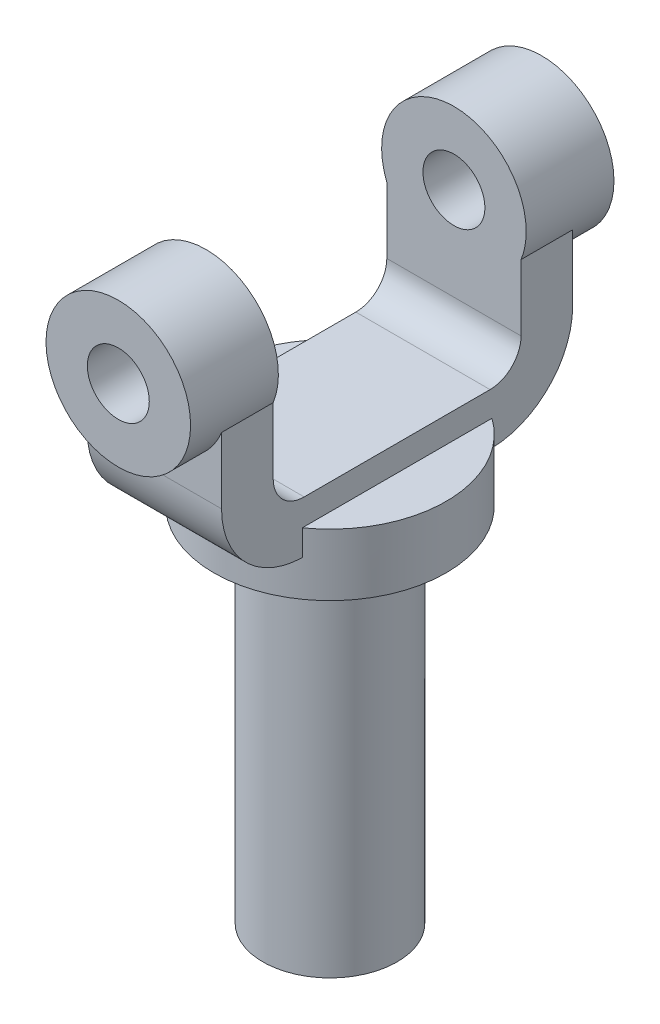
ISO-10303-21;
HEADER;
FILE_DESCRIPTION(('STEP AP214'),'2;1');
FILE_NAME('part.step','',(''),(''),'','','');
FILE_SCHEMA(('AUTOMOTIVE_DESIGN { 1 0 10303 214 1 1 1 1 }'));
ENDSEC;
DATA;
#1=APPLICATION_CONTEXT('core data for automotive mechanical design processes');
#2=APPLICATION_PROTOCOL_DEFINITION('international standard','automotive_design',2000,#1);
#3=PRODUCT_CONTEXT('',#1,'mechanical');
#4=PRODUCT('Part','Part','',(#3));
#5=PRODUCT_RELATED_PRODUCT_CATEGORY('part','',(#4));
#6=PRODUCT_DEFINITION_FORMATION('','',#4);
#7=PRODUCT_DEFINITION_CONTEXT('part definition',#1,'design');
#8=PRODUCT_DEFINITION('design','',#6,#7);
#9=PRODUCT_DEFINITION_SHAPE('','',#8);
#10=(LENGTH_UNIT() NAMED_UNIT(*) SI_UNIT(.MILLI.,.METRE.));
#11=(NAMED_UNIT(*) PLANE_ANGLE_UNIT() SI_UNIT($,.RADIAN.));
#12=(NAMED_UNIT(*) SI_UNIT($,.STERADIAN.) SOLID_ANGLE_UNIT());
#13=UNCERTAINTY_MEASURE_WITH_UNIT(LENGTH_MEASURE(1.E-05),#10,'distance_accuracy_value','');
#14=(GEOMETRIC_REPRESENTATION_CONTEXT(3) GLOBAL_UNCERTAINTY_ASSIGNED_CONTEXT((#13)) GLOBAL_UNIT_ASSIGNED_CONTEXT((#10,
#11,#12)) REPRESENTATION_CONTEXT('',''));
#15=CARTESIAN_POINT('',(0.,0.,0.));
#16=DIRECTION('',(0.,0.,1.));
#17=DIRECTION('',(1.,0.,0.));
#18=AXIS2_PLACEMENT_3D('',#15,#16,#17);
#19=CARTESIAN_POINT('',(13.,11.,18.));
#20=DIRECTION('',(-1.,0.,0.));
#21=DIRECTION('',(0.,0.,1.));
#22=AXIS2_PLACEMENT_3D('',#19,#20,#21);
#23=PLANE('',#22);
#24=DIRECTION('',(0.,0.,-1.));
#25=VECTOR('',#24,1.);
#26=CARTESIAN_POINT('',(13.,23.8079969841098,41.));
#27=LINE('',#26,#25);
#28=CARTESIAN_POINT('',(13.,23.8079969841098,34.));
#29=VERTEX_POINT('',#28);
#30=CARTESIAN_POINT('',(13.,23.8079969841098,24.));
#31=VERTEX_POINT('',#30);
#32=EDGE_CURVE('E145',#29,#31,#27,.T.);
#33=ORIENTED_EDGE('',*,*,#32,.F.);
#34=DIRECTION('',(0.,-1.,0.));
#35=VECTOR('',#34,1.);
#36=CARTESIAN_POINT('',(13.,29.,34.));
#37=LINE('',#36,#35);
#38=CARTESIAN_POINT('',(13.,11.,34.));
#39=VERTEX_POINT('',#38);
#40=EDGE_CURVE('E167',#29,#39,#37,.T.);
#41=ORIENTED_EDGE('',*,*,#40,.T.);
#42=CARTESIAN_POINT('',(13.,11.,18.));
#43=DIRECTION('',(-1.,0.,0.));
#44=DIRECTION('',(0.,0.,1.));
#45=AXIS2_PLACEMENT_3D('',#42,#43,#44);
#46=CIRCLE('',#45,16.);
#47=CARTESIAN_POINT('',(13.,-4.99585059318355,18.364367672207));
#48=VERTEX_POINT('',#47);
#49=EDGE_CURVE('E169',#48,#39,#46,.T.);
#50=ORIENTED_EDGE('',*,*,#49,.F.);
#51=DIRECTION('',(0.,-1.,0.));
#52=VECTOR('',#51,1.);
#53=CARTESIAN_POINT('',(13.,0.,18.364367672207));
#54=LINE('',#53,#52);
#55=CARTESIAN_POINT('',(13.,0.,18.364367672207));
#56=VERTEX_POINT('',#55);
#57=EDGE_CURVE('E253',#56,#48,#54,.T.);
#58=ORIENTED_EDGE('',*,*,#57,.F.);
#59=DIRECTION('',(0.,0.,1.));
#60=VECTOR('',#59,1.);
#61=CARTESIAN_POINT('',(13.,0.,0.));
#62=LINE('',#61,#60);
#63=CARTESIAN_POINT('',(13.,0.,-18.364367672207));
#64=VERTEX_POINT('',#63);
#65=EDGE_CURVE('E230',#64,#56,#62,.T.);
#66=ORIENTED_EDGE('',*,*,#65,.F.);
#67=DIRECTION('',(0.,-1.,0.));
#68=VECTOR('',#67,1.);
#69=CARTESIAN_POINT('',(13.,0.,-18.364367672207));
#70=LINE('',#69,#68);
#71=CARTESIAN_POINT('',(13.,-4.99585059318355,-18.364367672207));
#72=VERTEX_POINT('',#71);
#73=EDGE_CURVE('E536',#72,#64,#70,.F.);
#74=ORIENTED_EDGE('',*,*,#73,.F.);
#75=CARTESIAN_POINT('',(13.,11.,-18.));
#76=DIRECTION('',(1.,0.,0.));
#77=DIRECTION('',(0.,0.,-1.));
#78=AXIS2_PLACEMENT_3D('',#75,#76,#77);
#79=CIRCLE('',#78,16.);
#80=CARTESIAN_POINT('',(13.,11.,-34.));
#81=VERTEX_POINT('',#80);
#82=EDGE_CURVE('E179',#72,#81,#79,.T.);
#83=ORIENTED_EDGE('',*,*,#82,.T.);
#84=DIRECTION('',(0.,-1.,0.));
#85=VECTOR('',#84,1.);
#86=CARTESIAN_POINT('',(13.,29.,-34.));
#87=LINE('',#86,#85);
#88=CARTESIAN_POINT('',(13.,23.8079969841098,-34.));
#89=VERTEX_POINT('',#88);
#90=EDGE_CURVE('E178',#89,#81,#87,.T.);
#91=ORIENTED_EDGE('',*,*,#90,.F.);
#92=DIRECTION('',(0.,0.,1.));
#93=VECTOR('',#92,1.);
#94=CARTESIAN_POINT('',(13.,23.8079969841098,-41.));
#95=LINE('',#94,#93);
#96=CARTESIAN_POINT('',(13.,23.8079969841098,-24.));
#97=VERTEX_POINT('',#96);
#98=EDGE_CURVE('E69',#89,#97,#95,.T.);
#99=ORIENTED_EDGE('',*,*,#98,.T.);
#100=DIRECTION('',(0.,1.,0.));
#101=VECTOR('',#100,1.);
#102=CARTESIAN_POINT('',(13.,11.,-24.));
#103=LINE('',#102,#101);
#104=CARTESIAN_POINT('',(13.,11.,-24.));
#105=VERTEX_POINT('',#104);
#106=EDGE_CURVE('E182',#105,#97,#103,.T.);
#107=ORIENTED_EDGE('',*,*,#106,.F.);
#108=CARTESIAN_POINT('',(13.,11.,-18.));
#109=DIRECTION('',(1.,0.,0.));
#110=DIRECTION('',(0.,0.,-1.));
#111=AXIS2_PLACEMENT_3D('',#108,#109,#110);
#112=CIRCLE('',#111,6.);
#113=CARTESIAN_POINT('',(13.,5.,-18.));
#114=VERTEX_POINT('',#113);
#115=EDGE_CURVE('E181',#114,#105,#112,.T.);
#116=ORIENTED_EDGE('',*,*,#115,.F.);
#117=DIRECTION('',(0.,0.,-1.));
#118=VECTOR('',#117,1.);
#119=CARTESIAN_POINT('',(13.,5.,18.));
#120=LINE('',#119,#118);
#121=CARTESIAN_POINT('',(13.,5.,18.));
#122=VERTEX_POINT('',#121);
#123=EDGE_CURVE('E186',#122,#114,#120,.T.);
#124=ORIENTED_EDGE('',*,*,#123,.F.);
#125=CARTESIAN_POINT('',(13.,11.,18.));
#126=DIRECTION('',(-1.,0.,0.));
#127=DIRECTION('',(0.,0.,1.));
#128=AXIS2_PLACEMENT_3D('',#125,#126,#127);
#129=CIRCLE('',#128,6.);
#130=CARTESIAN_POINT('',(13.,11.,24.));
#131=VERTEX_POINT('',#130);
#132=EDGE_CURVE('E163',#122,#131,#129,.T.);
#133=ORIENTED_EDGE('',*,*,#132,.T.);
#134=DIRECTION('',(0.,1.,0.));
#135=VECTOR('',#134,1.);
#136=CARTESIAN_POINT('',(13.,11.,24.));
#137=LINE('',#136,#135);
#138=EDGE_CURVE('E156',#131,#31,#137,.T.);
#139=ORIENTED_EDGE('',*,*,#138,.T.);
#140=EDGE_LOOP('',(#33,#41,#50,#58,#66,#74,#83,#91,#99,#107,#116,#124,#133,#139));
#141=FACE_BOUND('',#140,.T.);
#142=ADVANCED_FACE('F43',(#141),#23,.F.);
#143=CARTESIAN_POINT('',(-13.,11.,18.));
#144=DIRECTION('',(-1.,0.,0.));
#145=DIRECTION('',(0.,0.,1.));
#146=AXIS2_PLACEMENT_3D('',#143,#144,#145);
#147=PLANE('',#146);
#148=DIRECTION('',(0.,-1.,0.));
#149=VECTOR('',#148,1.);
#150=CARTESIAN_POINT('',(-13.,29.,34.));
#151=LINE('',#150,#149);
#152=CARTESIAN_POINT('',(-13.,23.8079969841098,34.));
#153=VERTEX_POINT('',#152);
#154=CARTESIAN_POINT('',(-13.,11.,34.));
#155=VERTEX_POINT('',#154);
#156=EDGE_CURVE('E193',#153,#155,#151,.T.);
#157=ORIENTED_EDGE('',*,*,#156,.F.);
#158=DIRECTION('',(0.,0.,-1.));
#159=VECTOR('',#158,1.);
#160=CARTESIAN_POINT('',(-13.,23.8079969841098,41.));
#161=LINE('',#160,#159);
#162=CARTESIAN_POINT('',(-13.,23.8079969841098,24.));
#163=VERTEX_POINT('',#162);
#164=EDGE_CURVE('E552',#153,#163,#161,.T.);
#165=ORIENTED_EDGE('',*,*,#164,.T.);
#166=DIRECTION('',(0.,1.,0.));
#167=VECTOR('',#166,1.);
#168=CARTESIAN_POINT('',(-13.,11.,24.));
#169=LINE('',#168,#167);
#170=CARTESIAN_POINT('',(-13.,11.,24.));
#171=VERTEX_POINT('',#170);
#172=EDGE_CURVE('E158',#171,#163,#169,.T.);
#173=ORIENTED_EDGE('',*,*,#172,.F.);
#174=CARTESIAN_POINT('',(-13.,11.,18.));
#175=DIRECTION('',(-1.,0.,0.));
#176=DIRECTION('',(0.,0.,1.));
#177=AXIS2_PLACEMENT_3D('',#174,#175,#176);
#178=CIRCLE('',#177,6.);
#179=CARTESIAN_POINT('',(-13.,5.,18.));
#180=VERTEX_POINT('',#179);
#181=EDGE_CURVE('E189',#180,#171,#178,.T.);
#182=ORIENTED_EDGE('',*,*,#181,.F.);
#183=DIRECTION('',(0.,0.,-1.));
#184=VECTOR('',#183,1.);
#185=CARTESIAN_POINT('',(-13.,5.,18.));
#186=LINE('',#185,#184);
#187=CARTESIAN_POINT('',(-13.,5.,-18.));
#188=VERTEX_POINT('',#187);
#189=EDGE_CURVE('E168',#180,#188,#186,.T.);
#190=ORIENTED_EDGE('',*,*,#189,.T.);
#191=CARTESIAN_POINT('',(-13.,11.,-18.));
#192=DIRECTION('',(1.,0.,0.));
#193=DIRECTION('',(0.,0.,-1.));
#194=AXIS2_PLACEMENT_3D('',#191,#192,#193);
#195=CIRCLE('',#194,6.);
#196=CARTESIAN_POINT('',(-13.,11.,-24.));
#197=VERTEX_POINT('',#196);
#198=EDGE_CURVE('E206',#188,#197,#195,.T.);
#199=ORIENTED_EDGE('',*,*,#198,.T.);
#200=DIRECTION('',(0.,1.,0.));
#201=VECTOR('',#200,1.);
#202=CARTESIAN_POINT('',(-13.,11.,-24.));
#203=LINE('',#202,#201);
#204=CARTESIAN_POINT('',(-13.,23.8079969841098,-24.));
#205=VERTEX_POINT('',#204);
#206=EDGE_CURVE('E204',#197,#205,#203,.T.);
#207=ORIENTED_EDGE('',*,*,#206,.T.);
#208=DIRECTION('',(0.,0.,1.));
#209=VECTOR('',#208,1.);
#210=CARTESIAN_POINT('',(-13.,23.8079969841098,-41.));
#211=LINE('',#210,#209);
#212=CARTESIAN_POINT('',(-13.,23.8079969841098,-34.));
#213=VERTEX_POINT('',#212);
#214=EDGE_CURVE('E548',#213,#205,#211,.T.);
#215=ORIENTED_EDGE('',*,*,#214,.F.);
#216=DIRECTION('',(0.,-1.,0.));
#217=VECTOR('',#216,1.);
#218=CARTESIAN_POINT('',(-13.,29.,-34.));
#219=LINE('',#218,#217);
#220=CARTESIAN_POINT('',(-13.,11.,-34.));
#221=VERTEX_POINT('',#220);
#222=EDGE_CURVE('E205',#213,#221,#219,.T.);
#223=ORIENTED_EDGE('',*,*,#222,.T.);
#224=CARTESIAN_POINT('',(-13.,11.,-18.));
#225=DIRECTION('',(1.,0.,0.));
#226=DIRECTION('',(0.,0.,-1.));
#227=AXIS2_PLACEMENT_3D('',#224,#225,#226);
#228=CIRCLE('',#227,16.);
#229=CARTESIAN_POINT('',(-13.,-4.99585059318355,-18.364367672207));
#230=VERTEX_POINT('',#229);
#231=EDGE_CURVE('E200',#230,#221,#228,.T.);
#232=ORIENTED_EDGE('',*,*,#231,.F.);
#233=DIRECTION('',(0.,-1.,0.));
#234=VECTOR('',#233,1.);
#235=CARTESIAN_POINT('',(-13.,0.,-18.364367672207));
#236=LINE('',#235,#234);
#237=CARTESIAN_POINT('',(-13.,0.,-18.364367672207));
#238=VERTEX_POINT('',#237);
#239=EDGE_CURVE('E538',#230,#238,#236,.F.);
#240=ORIENTED_EDGE('',*,*,#239,.T.);
#241=DIRECTION('',(0.,0.,1.));
#242=VECTOR('',#241,1.);
#243=CARTESIAN_POINT('',(-13.,0.,0.));
#244=LINE('',#243,#242);
#245=CARTESIAN_POINT('',(-13.,0.,18.364367672207));
#246=VERTEX_POINT('',#245);
#247=EDGE_CURVE('E221',#238,#246,#244,.T.);
#248=ORIENTED_EDGE('',*,*,#247,.T.);
#249=DIRECTION('',(0.,-1.,0.));
#250=VECTOR('',#249,1.);
#251=CARTESIAN_POINT('',(-13.,0.,18.364367672207));
#252=LINE('',#251,#250);
#253=CARTESIAN_POINT('',(-13.,-4.99585059318355,18.364367672207));
#254=VERTEX_POINT('',#253);
#255=EDGE_CURVE('E239',#246,#254,#252,.T.);
#256=ORIENTED_EDGE('',*,*,#255,.T.);
#257=CARTESIAN_POINT('',(-13.,11.,18.));
#258=DIRECTION('',(-1.,0.,0.));
#259=DIRECTION('',(0.,0.,1.));
#260=AXIS2_PLACEMENT_3D('',#257,#258,#259);
#261=CIRCLE('',#260,16.);
#262=EDGE_CURVE('E198',#254,#155,#261,.T.);
#263=ORIENTED_EDGE('',*,*,#262,.T.);
#264=EDGE_LOOP('',(#157,#165,#173,#182,#190,#199,#207,#215,#223,#232,#240,#248,#256,#263));
#265=FACE_BOUND('',#264,.T.);
#266=ADVANCED_FACE('F293',(#265),#147,.T.);
#267=CARTESIAN_POINT('',(0.,0.,0.));
#268=DIRECTION('',(0.,1.,0.));
#269=DIRECTION('',(0.,0.,1.));
#270=AXIS2_PLACEMENT_3D('',#267,#268,#269);
#271=PLANE('',#270);
#272=CARTESIAN_POINT('',(0.,0.,0.));
#273=DIRECTION('',(0.,-1.,0.));
#274=DIRECTION('',(0.,0.,-1.));
#275=AXIS2_PLACEMENT_3D('',#272,#273,#274);
#276=CIRCLE('',#275,22.5);
#277=EDGE_CURVE('E237',#64,#56,#276,.T.);
#278=ORIENTED_EDGE('',*,*,#277,.F.);
#279=ORIENTED_EDGE('',*,*,#65,.T.);
#280=EDGE_LOOP('',(#278,#279));
#281=FACE_BOUND('',#280,.T.);
#282=ADVANCED_FACE('F295',(#281),#271,.T.);
#283=CARTESIAN_POINT('',(0.,0.,0.));
#284=DIRECTION('',(0.,-1.,0.));
#285=DIRECTION('',(0.,0.,-1.));
#286=AXIS2_PLACEMENT_3D('',#283,#284,#285);
#287=CYLINDRICAL_SURFACE('',#286,22.5);
#288=CARTESIAN_POINT('',(0.,-12.,0.));
#289=DIRECTION('',(0.,-1.,0.));
#290=DIRECTION('',(0.,0.,-1.));
#291=AXIS2_PLACEMENT_3D('',#288,#289,#290);
#292=CIRCLE('',#291,22.5);
#293=CARTESIAN_POINT('',(0.,-12.,-22.5));
#294=VERTEX_POINT('',#293);
#295=EDGE_CURVE('E231',#294,#294,#292,.T.);
#296=ORIENTED_EDGE('',*,*,#295,.F.);
#297=EDGE_LOOP('',(#296));
#298=FACE_BOUND('',#297,.T.);
#299=CARTESIAN_POINT('',(-13.,-4.99585059318355,-18.364367672207));
#300=CARTESIAN_POINT('',(-12.7215458753434,-4.99135097028926,-18.5614910741229));
#301=CARTESIAN_POINT('',(-12.4386628260232,-4.98336982753203,-18.7522272087253));
#302=CARTESIAN_POINT('',(-11.8647107842214,-4.96178263653701,-19.1205338628348));
#303=CARTESIAN_POINT('',(-11.5736429171154,-4.94817735810222,-19.2981061802168));
#304=CARTESIAN_POINT('',(-10.9840075811312,-4.91668292674559,-19.6396955554084));
#305=CARTESIAN_POINT('',(-10.6854424540463,-4.89879509695365,-19.8037167789294));
#306=CARTESIAN_POINT('',(-10.081348842428,-4.85999016289694,-20.1179612826371));
#307=CARTESIAN_POINT('',(-9.77582012008982,-4.83907295504884,-20.2681840907282));
#308=CARTESIAN_POINT('',(-8.84948412358385,-4.77358200454363,-20.6978227158686));
#309=CARTESIAN_POINT('',(-8.21895208473221,-4.7262704753656,-20.9561942217384));
#310=CARTESIAN_POINT('',(-6.93706961922338,-4.63311977109481,-21.4147274829306));
#311=CARTESIAN_POINT('',(-6.28571969647543,-4.5872805604175,-21.6148906460378));
#312=CARTESIAN_POINT('',(-5.02094333084133,-4.50774471199429,-21.9415380154631));
#313=CARTESIAN_POINT('',(-4.40876948821724,-4.47336177657509,-22.0727076735311));
#314=CARTESIAN_POINT('',(-3.17511314336837,-4.41630663483061,-22.2836303655867));
#315=CARTESIAN_POINT('',(-2.55363149269107,-4.39363336387156,-22.363388074073));
#316=CARTESIAN_POINT('',(-1.30668153440075,-4.36280318533875,-22.4707282228748));
#317=CARTESIAN_POINT('',(-0.681219989024235,-4.35462609321337,-22.498383214647));
#318=CARTESIAN_POINT('',(0.569839204405832,-4.35371937052489,-22.5014789442671));
#319=CARTESIAN_POINT('',(1.19543685032656,-4.36098951318967,-22.4769204486315));
#320=CARTESIAN_POINT('',(2.43003830113889,-4.38980998238654,-22.376798164846));
#321=CARTESIAN_POINT('',(3.03912959150793,-4.41108248273742,-22.3022261803641));
#322=CARTESIAN_POINT('',(4.24872130944983,-4.46512559663003,-22.1037106890209));
#323=CARTESIAN_POINT('',(4.84922116239662,-4.49789697555077,-21.9797638956394));
#324=CARTESIAN_POINT('',(6.0379340320533,-4.57099864773306,-21.6833767601849));
#325=CARTESIAN_POINT('',(6.62614094039945,-4.6113326040358,-21.5109128978432));
#326=CARTESIAN_POINT('',(7.78629772211091,-4.69439511546075,-21.118673211494));
#327=CARTESIAN_POINT('',(8.35825113668193,-4.73712314285536,-20.898907784108));
#328=CARTESIAN_POINT('',(9.27903247867884,-4.80405691334984,-20.5012757871054));
#329=CARTESIAN_POINT('',(9.63372177467226,-4.82937113680732,-20.3370155975623));
#330=CARTESIAN_POINT('',(10.3341727377035,-4.87670598294214,-19.9901860009594));
#331=CARTESIAN_POINT('',(10.6799367173762,-4.89872746603352,-19.8076213978625));
#332=CARTESIAN_POINT('',(11.360966901437,-4.93757508378593,-19.4249998314684));
#333=CARTESIAN_POINT('',(11.6962542571782,-4.95441238828696,-19.2249816849477));
#334=CARTESIAN_POINT('',(12.3562994763742,-4.98097160990848,-18.8075656793902));
#335=CARTESIAN_POINT('',(12.6810531262212,-4.99069071240722,-18.5901609831522));
#336=CARTESIAN_POINT('',(13.,-4.99585059318355,-18.364367672207));
#337=B_SPLINE_CURVE_WITH_KNOTS('',3,(#299,#300,#301,#302,#303,#304,#305,#306,#307,#308,#309,
#310,#311,#312,#313,#314,#315,#316,#317,#318,#319,#320,#321,#322,#323,#324,#325,#326,#327,#328,
#329,#330,#331,#332,#333,#334,#335,#336),.UNSPECIFIED.,.F.,.F.,(4,2,2,2,2,2,2,2,2,2,2,2,2,2,2,2,
2,2,4),(0.,1.0234370770563,2.04673411762319,3.06971540912148,4.09273168761766,6.13885092916604,
8.18492068063765,10.0637292280052,11.9423669254479,13.8183867377297,15.6943790094146,
17.5342276877946,19.3741988519249,21.2150635451933,23.0555240390444,24.2301332786575,
25.4044350469743,26.5761886654492,27.7484053594669),.UNSPECIFIED.);
#338=EDGE_CURVE('E539',#230,#72,#337,.T.);
#339=ORIENTED_EDGE('',*,*,#338,.T.);
#340=ORIENTED_EDGE('',*,*,#73,.T.);
#341=ORIENTED_EDGE('',*,*,#277,.T.);
#342=ORIENTED_EDGE('',*,*,#57,.T.);
#343=CARTESIAN_POINT('',(-13.,-4.99585059318355,18.364367672207));
#344=CARTESIAN_POINT('',(-12.7215458753434,-4.99135097028926,18.5614910741229));
#345=CARTESIAN_POINT('',(-12.4386628260232,-4.98336982753203,18.7522272087253));
#346=CARTESIAN_POINT('',(-11.8647107842214,-4.96178263653701,19.1205338628348));
#347=CARTESIAN_POINT('',(-11.5736429171154,-4.94817735810222,19.2981061802168));
#348=CARTESIAN_POINT('',(-10.9840075811312,-4.91668292674559,19.6396955554084));
#349=CARTESIAN_POINT('',(-10.6854424540463,-4.89879509695365,19.8037167789294));
#350=CARTESIAN_POINT('',(-10.081348842428,-4.85999016289694,20.1179612826371));
#351=CARTESIAN_POINT('',(-9.77582012008982,-4.83907295504884,20.2681840907282));
#352=CARTESIAN_POINT('',(-8.84948412358385,-4.77358200454363,20.6978227158686));
#353=CARTESIAN_POINT('',(-8.21895208473221,-4.7262704753656,20.9561942217384));
#354=CARTESIAN_POINT('',(-6.93706961922338,-4.63311977109481,21.4147274829306));
#355=CARTESIAN_POINT('',(-6.28571969647543,-4.5872805604175,21.6148906460378));
#356=CARTESIAN_POINT('',(-5.02094333084133,-4.50774471199429,21.9415380154631));
#357=CARTESIAN_POINT('',(-4.40876948821724,-4.47336177657509,22.0727076735311));
#358=CARTESIAN_POINT('',(-3.17511314336837,-4.41630663483061,22.2836303655867));
#359=CARTESIAN_POINT('',(-2.55363149269107,-4.39363336387156,22.363388074073));
#360=CARTESIAN_POINT('',(-1.30668153440075,-4.36280318533875,22.4707282228748));
#361=CARTESIAN_POINT('',(-0.681219989024235,-4.35462609321337,22.498383214647));
#362=CARTESIAN_POINT('',(0.569839204405832,-4.35371937052489,22.5014789442671));
#363=CARTESIAN_POINT('',(1.19543685032656,-4.36098951318967,22.4769204486315));
#364=CARTESIAN_POINT('',(2.43003830113889,-4.38980998238654,22.376798164846));
#365=CARTESIAN_POINT('',(3.03912959150793,-4.41108248273742,22.3022261803641));
#366=CARTESIAN_POINT('',(4.24872130944983,-4.46512559663003,22.1037106890209));
#367=CARTESIAN_POINT('',(4.84922116239662,-4.49789697555077,21.9797638956394));
#368=CARTESIAN_POINT('',(6.0379340320533,-4.57099864773306,21.6833767601849));
#369=CARTESIAN_POINT('',(6.62614094039945,-4.6113326040358,21.5109128978432));
#370=CARTESIAN_POINT('',(7.78629772211091,-4.69439511546075,21.118673211494));
#371=CARTESIAN_POINT('',(8.35825113668193,-4.73712314285536,20.898907784108));
#372=CARTESIAN_POINT('',(9.27903247867884,-4.80405691334984,20.5012757871054));
#373=CARTESIAN_POINT('',(9.63372177467226,-4.82937113680732,20.3370155975623));
#374=CARTESIAN_POINT('',(10.3341727377035,-4.87670598294214,19.9901860009594));
#375=CARTESIAN_POINT('',(10.6799367173762,-4.89872746603352,19.8076213978625));
#376=CARTESIAN_POINT('',(11.360966901437,-4.93757508378593,19.4249998314684));
#377=CARTESIAN_POINT('',(11.6962542571782,-4.95441238828696,19.2249816849477));
#378=CARTESIAN_POINT('',(12.3562994763742,-4.98097160990848,18.8075656793902));
#379=CARTESIAN_POINT('',(12.6810531262212,-4.99069071240722,18.5901609831522));
#380=CARTESIAN_POINT('',(13.,-4.99585059318355,18.364367672207));
#381=B_SPLINE_CURVE_WITH_KNOTS('',3,(#343,#344,#345,#346,#347,#348,#349,#350,#351,#352,#353,
#354,#355,#356,#357,#358,#359,#360,#361,#362,#363,#364,#365,#366,#367,#368,#369,#370,#371,#372,
#373,#374,#375,#376,#377,#378,#379,#380),.UNSPECIFIED.,.F.,.F.,(4,2,2,2,2,2,2,2,2,2,2,2,2,2,2,2,
2,2,4),(0.,1.0234370770563,2.04673411762319,3.06971540912148,4.09273168761766,6.13885092916604,
8.18492068063765,10.0637292280052,11.9423669254479,13.8183867377297,15.6943790094146,
17.5342276877946,19.3741988519249,21.2150635451933,23.0555240390444,24.2301332786575,
25.4044350469743,26.5761886654492,27.7484053594669),.UNSPECIFIED.);
#382=EDGE_CURVE('E245',#254,#48,#381,.T.);
#383=ORIENTED_EDGE('',*,*,#382,.F.);
#384=ORIENTED_EDGE('',*,*,#255,.F.);
#385=EDGE_CURVE('E232',#246,#238,#276,.T.);
#386=ORIENTED_EDGE('',*,*,#385,.T.);
#387=ORIENTED_EDGE('',*,*,#239,.F.);
#388=EDGE_LOOP('',(#339,#340,#341,#342,#383,#384,#386,#387));
#389=FACE_BOUND('',#388,.T.);
#390=ADVANCED_FACE('F251',(#298,#389),#287,.T.);
#391=ORIENTED_EDGE('',*,*,#247,.F.);
#392=ORIENTED_EDGE('',*,*,#385,.F.);
#393=EDGE_LOOP('',(#391,#392));
#394=FACE_BOUND('',#393,.T.);
#395=ADVANCED_FACE('F284',(#394),#271,.T.);
#396=CARTESIAN_POINT('',(22.5,-12.,0.));
#397=DIRECTION('',(0.,-1.,0.));
#398=DIRECTION('',(0.,0.,-1.));
#399=AXIS2_PLACEMENT_3D('',#396,#397,#398);
#400=PLANE('',#399);
#401=CARTESIAN_POINT('',(0.,-12.,0.));
#402=DIRECTION('',(0.,-1.,0.));
#403=DIRECTION('',(0.,0.,-1.));
#404=AXIS2_PLACEMENT_3D('',#401,#402,#403);
#405=CIRCLE('',#404,15.);
#406=CARTESIAN_POINT('',(0.,-12.,-15.));
#407=VERTEX_POINT('',#406);
#408=EDGE_CURVE('E11',#407,#407,#405,.F.);
#409=ORIENTED_EDGE('',*,*,#408,.T.);
#410=EDGE_LOOP('',(#409));
#411=FACE_BOUND('',#410,.T.);
#412=ORIENTED_EDGE('',*,*,#295,.T.);
#413=EDGE_LOOP('',(#412));
#414=FACE_BOUND('',#413,.T.);
#415=ADVANCED_FACE('F285',(#411,#414),#400,.T.);
#416=CARTESIAN_POINT('',(0.,0.,0.));
#417=DIRECTION('',(0.,-1.,0.));
#418=DIRECTION('',(0.,0.,-1.));
#419=AXIS2_PLACEMENT_3D('',#416,#417,#418);
#420=CYLINDRICAL_SURFACE('',#419,13.);
#421=CARTESIAN_POINT('',(0.,-14.,0.));
#422=DIRECTION('',(0.,-1.,0.));
#423=DIRECTION('',(0.,0.,-1.));
#424=AXIS2_PLACEMENT_3D('',#421,#422,#423);
#425=CIRCLE('',#424,13.);
#426=CARTESIAN_POINT('',(0.,-14.,-13.));
#427=VERTEX_POINT('',#426);
#428=EDGE_CURVE('E51',#427,#427,#425,.T.);
#429=ORIENTED_EDGE('',*,*,#428,.T.);
#430=EDGE_LOOP('',(#429));
#431=FACE_BOUND('',#430,.T.);
#432=CARTESIAN_POINT('',(0.,-82.,0.));
#433=DIRECTION('',(0.,-1.,0.));
#434=DIRECTION('',(0.,0.,-1.));
#435=AXIS2_PLACEMENT_3D('',#432,#433,#434);
#436=CIRCLE('',#435,13.);
#437=CARTESIAN_POINT('',(0.,-82.,-13.));
#438=VERTEX_POINT('',#437);
#439=EDGE_CURVE('E228',#438,#438,#436,.T.);
#440=ORIENTED_EDGE('',*,*,#439,.F.);
#441=EDGE_LOOP('',(#440));
#442=FACE_BOUND('',#441,.T.);
#443=ADVANCED_FACE('F276',(#431,#442),#420,.T.);
#444=CARTESIAN_POINT('',(13.,-82.,0.));
#445=DIRECTION('',(0.,-1.,0.));
#446=DIRECTION('',(0.,0.,-1.));
#447=AXIS2_PLACEMENT_3D('',#444,#445,#446);
#448=PLANE('',#447);
#449=ORIENTED_EDGE('',*,*,#439,.T.);
#450=EDGE_LOOP('',(#449));
#451=FACE_BOUND('',#450,.T.);
#452=ADVANCED_FACE('F274',(#451),#448,.T.);
#453=CARTESIAN_POINT('',(13.,11.,18.));
#454=DIRECTION('',(-1.,0.,0.));
#455=DIRECTION('',(0.,0.,1.));
#456=AXIS2_PLACEMENT_3D('',#453,#454,#455);
#457=CYLINDRICAL_SURFACE('',#456,6.);
#458=ORIENTED_EDGE('',*,*,#181,.T.);
#459=DIRECTION('',(-1.,0.,0.));
#460=VECTOR('',#459,1.);
#461=CARTESIAN_POINT('',(13.,11.,24.));
#462=LINE('',#461,#460);
#463=EDGE_CURVE('E225',#131,#171,#462,.T.);
#464=ORIENTED_EDGE('',*,*,#463,.F.);
#465=ORIENTED_EDGE('',*,*,#132,.F.);
#466=DIRECTION('',(-1.,0.,0.));
#467=VECTOR('',#466,1.);
#468=CARTESIAN_POINT('',(13.,5.,18.));
#469=LINE('',#468,#467);
#470=EDGE_CURVE('E188',#122,#180,#469,.T.);
#471=ORIENTED_EDGE('',*,*,#470,.T.);
#472=EDGE_LOOP('',(#458,#464,#465,#471));
#473=FACE_BOUND('',#472,.T.);
#474=ADVANCED_FACE('F271',(#473),#457,.F.);
#475=CARTESIAN_POINT('',(13.,11.,24.));
#476=DIRECTION('',(0.,0.,1.));
#477=DIRECTION('',(0.,-1.,0.));
#478=AXIS2_PLACEMENT_3D('',#475,#476,#477);
#479=PLANE('',#478);
#480=CARTESIAN_POINT('',(0.,29.0041494068165,24.));
#481=DIRECTION('',(0.,0.,1.));
#482=DIRECTION('',(1.,0.,0.));
#483=AXIS2_PLACEMENT_3D('',#480,#481,#482);
#484=CIRCLE('',#483,6.);
#485=CARTESIAN_POINT('',(6.,29.0041494068165,24.));
#486=VERTEX_POINT('',#485);
#487=EDGE_CURVE('E351',#486,#486,#484,.T.);
#488=ORIENTED_EDGE('',*,*,#487,.T.);
#489=EDGE_LOOP('',(#488));
#490=FACE_BOUND('',#489,.T.);
#491=CARTESIAN_POINT('',(0.,29.0041494068165,24.));
#492=DIRECTION('',(0.,0.,1.));
#493=DIRECTION('',(1.,0.,0.));
#494=AXIS2_PLACEMENT_3D('',#491,#492,#493);
#495=CIRCLE('',#494,14.);
#496=EDGE_CURVE('E59',#31,#163,#495,.T.);
#497=ORIENTED_EDGE('',*,*,#496,.F.);
#498=ORIENTED_EDGE('',*,*,#138,.F.);
#499=ORIENTED_EDGE('',*,*,#463,.T.);
#500=ORIENTED_EDGE('',*,*,#172,.T.);
#501=EDGE_LOOP('',(#497,#498,#499,#500));
#502=FACE_BOUND('',#501,.T.);
#503=ADVANCED_FACE('F152',(#490,#502),#479,.F.);
#504=CARTESIAN_POINT('',(13.,29.,34.));
#505=DIRECTION('',(0.,0.,-1.));
#506=DIRECTION('',(-1.,0.,0.));
#507=AXIS2_PLACEMENT_3D('',#504,#505,#506);
#508=PLANE('',#507);
#509=CARTESIAN_POINT('',(0.,29.0041494068165,34.));
#510=DIRECTION('',(0.,0.,-1.));
#511=DIRECTION('',(-1.,0.,0.));
#512=AXIS2_PLACEMENT_3D('',#509,#510,#511);
#513=CIRCLE('',#512,14.);
#514=EDGE_CURVE('E150',#153,#29,#513,.F.);
#515=ORIENTED_EDGE('',*,*,#514,.F.);
#516=ORIENTED_EDGE('',*,*,#156,.T.);
#517=DIRECTION('',(-1.,0.,0.));
#518=VECTOR('',#517,1.);
#519=CARTESIAN_POINT('',(13.,11.,34.));
#520=LINE('',#519,#518);
#521=EDGE_CURVE('E218',#39,#155,#520,.T.);
#522=ORIENTED_EDGE('',*,*,#521,.F.);
#523=ORIENTED_EDGE('',*,*,#40,.F.);
#524=EDGE_LOOP('',(#515,#516,#522,#523));
#525=FACE_BOUND('',#524,.T.);
#526=ADVANCED_FACE('F265',(#525),#508,.F.);
#527=CARTESIAN_POINT('',(13.,11.,18.));
#528=DIRECTION('',(-1.,0.,0.));
#529=DIRECTION('',(0.,0.,1.));
#530=AXIS2_PLACEMENT_3D('',#527,#528,#529);
#531=CYLINDRICAL_SURFACE('',#530,16.);
#532=ORIENTED_EDGE('',*,*,#262,.F.);
#533=ORIENTED_EDGE('',*,*,#382,.T.);
#534=ORIENTED_EDGE('',*,*,#49,.T.);
#535=ORIENTED_EDGE('',*,*,#521,.T.);
#536=EDGE_LOOP('',(#532,#533,#534,#535));
#537=FACE_BOUND('',#536,.T.);
#538=ADVANCED_FACE('F258',(#537),#531,.T.);
#539=CARTESIAN_POINT('',(13.,11.,-18.));
#540=DIRECTION('',(-1.,0.,0.));
#541=DIRECTION('',(0.,0.,1.));
#542=AXIS2_PLACEMENT_3D('',#539,#540,#541);
#543=CYLINDRICAL_SURFACE('',#542,16.);
#544=ORIENTED_EDGE('',*,*,#338,.F.);
#545=ORIENTED_EDGE('',*,*,#231,.T.);
#546=DIRECTION('',(-1.,0.,0.));
#547=VECTOR('',#546,1.);
#548=CARTESIAN_POINT('',(13.,11.,-34.));
#549=LINE('',#548,#547);
#550=EDGE_CURVE('E216',#81,#221,#549,.T.);
#551=ORIENTED_EDGE('',*,*,#550,.F.);
#552=ORIENTED_EDGE('',*,*,#82,.F.);
#553=EDGE_LOOP('',(#544,#545,#551,#552));
#554=FACE_BOUND('',#553,.T.);
#555=ADVANCED_FACE('F261',(#554),#543,.T.);
#556=CARTESIAN_POINT('',(13.,29.,-34.));
#557=DIRECTION('',(0.,0.,-1.));
#558=DIRECTION('',(-1.,0.,0.));
#559=AXIS2_PLACEMENT_3D('',#556,#557,#558);
#560=PLANE('',#559);
#561=CARTESIAN_POINT('',(0.,29.0041494068165,-34.));
#562=DIRECTION('',(0.,0.,-1.));
#563=DIRECTION('',(-1.,0.,0.));
#564=AXIS2_PLACEMENT_3D('',#561,#562,#563);
#565=CIRCLE('',#564,14.);
#566=EDGE_CURVE('E327',#89,#213,#565,.T.);
#567=ORIENTED_EDGE('',*,*,#566,.F.);
#568=ORIENTED_EDGE('',*,*,#90,.T.);
#569=ORIENTED_EDGE('',*,*,#550,.T.);
#570=ORIENTED_EDGE('',*,*,#222,.F.);
#571=EDGE_LOOP('',(#567,#568,#569,#570));
#572=FACE_BOUND('',#571,.T.);
#573=ADVANCED_FACE('F320',(#572),#560,.T.);
#574=CARTESIAN_POINT('',(13.,11.,-24.));
#575=DIRECTION('',(0.,0.,1.));
#576=DIRECTION('',(0.,-1.,0.));
#577=AXIS2_PLACEMENT_3D('',#574,#575,#576);
#578=PLANE('',#577);
#579=CARTESIAN_POINT('',(0.,29.0041494068165,-24.));
#580=DIRECTION('',(0.,0.,1.));
#581=DIRECTION('',(1.,0.,0.));
#582=AXIS2_PLACEMENT_3D('',#579,#580,#581);
#583=CIRCLE('',#582,6.);
#584=CARTESIAN_POINT('',(6.,29.0041494068165,-24.));
#585=VERTEX_POINT('',#584);
#586=EDGE_CURVE('E147',#585,#585,#583,.T.);
#587=ORIENTED_EDGE('',*,*,#586,.F.);
#588=EDGE_LOOP('',(#587));
#589=FACE_BOUND('',#588,.T.);
#590=ORIENTED_EDGE('',*,*,#106,.T.);
#591=CARTESIAN_POINT('',(0.,29.0041494068165,-24.));
#592=DIRECTION('',(0.,0.,1.));
#593=DIRECTION('',(1.,0.,0.));
#594=AXIS2_PLACEMENT_3D('',#591,#592,#593);
#595=CIRCLE('',#594,14.);
#596=EDGE_CURVE('E337',#97,#205,#595,.T.);
#597=ORIENTED_EDGE('',*,*,#596,.T.);
#598=ORIENTED_EDGE('',*,*,#206,.F.);
#599=DIRECTION('',(-1.,0.,0.));
#600=VECTOR('',#599,1.);
#601=CARTESIAN_POINT('',(13.,11.,-24.));
#602=LINE('',#601,#600);
#603=EDGE_CURVE('E212',#105,#197,#602,.T.);
#604=ORIENTED_EDGE('',*,*,#603,.F.);
#605=EDGE_LOOP('',(#590,#597,#598,#604));
#606=FACE_BOUND('',#605,.T.);
#607=ADVANCED_FACE('F314',(#589,#606),#578,.T.);
#608=CARTESIAN_POINT('',(13.,11.,-18.));
#609=DIRECTION('',(-1.,0.,0.));
#610=DIRECTION('',(0.,0.,1.));
#611=AXIS2_PLACEMENT_3D('',#608,#609,#610);
#612=CYLINDRICAL_SURFACE('',#611,6.);
#613=ORIENTED_EDGE('',*,*,#198,.F.);
#614=DIRECTION('',(-1.,0.,0.));
#615=VECTOR('',#614,1.);
#616=CARTESIAN_POINT('',(13.,5.,-18.));
#617=LINE('',#616,#615);
#618=EDGE_CURVE('E215',#114,#188,#617,.T.);
#619=ORIENTED_EDGE('',*,*,#618,.F.);
#620=ORIENTED_EDGE('',*,*,#115,.T.);
#621=ORIENTED_EDGE('',*,*,#603,.T.);
#622=EDGE_LOOP('',(#613,#619,#620,#621));
#623=FACE_BOUND('',#622,.T.);
#624=ADVANCED_FACE('F309',(#623),#612,.F.);
#625=CARTESIAN_POINT('',(13.,5.,18.));
#626=DIRECTION('',(0.,1.,0.));
#627=DIRECTION('',(0.,0.,1.));
#628=AXIS2_PLACEMENT_3D('',#625,#626,#627);
#629=PLANE('',#628);
#630=ORIENTED_EDGE('',*,*,#189,.F.);
#631=ORIENTED_EDGE('',*,*,#470,.F.);
#632=ORIENTED_EDGE('',*,*,#123,.T.);
#633=ORIENTED_EDGE('',*,*,#618,.T.);
#634=EDGE_LOOP('',(#630,#631,#632,#633));
#635=FACE_BOUND('',#634,.T.);
#636=ADVANCED_FACE('F307',(#635),#629,.T.);
#637=CARTESIAN_POINT('',(0.,29.0041494068165,-41.));
#638=DIRECTION('',(0.,0.,1.));
#639=DIRECTION('',(1.,0.,0.));
#640=AXIS2_PLACEMENT_3D('',#637,#638,#639);
#641=CYLINDRICAL_SURFACE('',#640,14.);
#642=CARTESIAN_POINT('',(0.,29.0041494068165,-41.));
#643=DIRECTION('',(0.,0.,1.));
#644=DIRECTION('',(1.,0.,0.));
#645=AXIS2_PLACEMENT_3D('',#642,#643,#644);
#646=CIRCLE('',#645,14.);
#647=CARTESIAN_POINT('',(14.,29.0041494068165,-41.));
#648=VERTEX_POINT('',#647);
#649=EDGE_CURVE('E332',#648,#648,#646,.T.);
#650=ORIENTED_EDGE('',*,*,#649,.T.);
#651=EDGE_LOOP('',(#650));
#652=FACE_BOUND('',#651,.T.);
#653=ORIENTED_EDGE('',*,*,#98,.F.);
#654=ORIENTED_EDGE('',*,*,#566,.T.);
#655=ORIENTED_EDGE('',*,*,#214,.T.);
#656=ORIENTED_EDGE('',*,*,#596,.F.);
#657=EDGE_LOOP('',(#653,#654,#655,#656));
#658=FACE_BOUND('',#657,.T.);
#659=ADVANCED_FACE('F303',(#652,#658),#641,.T.);
#660=CARTESIAN_POINT('',(0.,29.0041494068165,-41.));
#661=DIRECTION('',(0.,0.,1.));
#662=DIRECTION('',(1.,0.,0.));
#663=AXIS2_PLACEMENT_3D('',#660,#661,#662);
#664=PLANE('',#663);
#665=CARTESIAN_POINT('',(0.,29.0041494068165,-41.));
#666=DIRECTION('',(0.,0.,1.));
#667=DIRECTION('',(1.,0.,0.));
#668=AXIS2_PLACEMENT_3D('',#665,#666,#667);
#669=CIRCLE('',#668,6.);
#670=CARTESIAN_POINT('',(6.,29.0041494068165,-41.));
#671=VERTEX_POINT('',#670);
#672=EDGE_CURVE('E344',#671,#671,#669,.T.);
#673=ORIENTED_EDGE('',*,*,#672,.T.);
#674=EDGE_LOOP('',(#673));
#675=FACE_BOUND('',#674,.T.);
#676=ORIENTED_EDGE('',*,*,#649,.F.);
#677=EDGE_LOOP('',(#676));
#678=FACE_BOUND('',#677,.T.);
#679=ADVANCED_FACE('F374',(#675,#678),#664,.F.);
#680=CARTESIAN_POINT('',(0.,29.0041494068165,-41.));
#681=DIRECTION('',(0.,0.,1.));
#682=DIRECTION('',(1.,0.,0.));
#683=AXIS2_PLACEMENT_3D('',#680,#681,#682);
#684=CYLINDRICAL_SURFACE('',#683,6.);
#685=ORIENTED_EDGE('',*,*,#586,.T.);
#686=EDGE_LOOP('',(#685));
#687=FACE_BOUND('',#686,.T.);
#688=ORIENTED_EDGE('',*,*,#672,.F.);
#689=EDGE_LOOP('',(#688));
#690=FACE_BOUND('',#689,.T.);
#691=ADVANCED_FACE('F373',(#687,#690),#684,.F.);
#692=CARTESIAN_POINT('',(0.,29.0041494068165,41.));
#693=DIRECTION('',(0.,0.,-1.));
#694=DIRECTION('',(-1.,0.,0.));
#695=AXIS2_PLACEMENT_3D('',#692,#693,#694);
#696=CYLINDRICAL_SURFACE('',#695,6.);
#697=CARTESIAN_POINT('',(0.,29.0041494068165,41.));
#698=DIRECTION('',(0.,0.,1.));
#699=DIRECTION('',(1.,0.,0.));
#700=AXIS2_PLACEMENT_3D('',#697,#698,#699);
#701=CIRCLE('',#700,6.);
#702=CARTESIAN_POINT('',(6.,29.0041494068165,41.));
#703=VERTEX_POINT('',#702);
#704=EDGE_CURVE('E159',#703,#703,#701,.T.);
#705=ORIENTED_EDGE('',*,*,#704,.T.);
#706=EDGE_LOOP('',(#705));
#707=FACE_BOUND('',#706,.T.);
#708=ORIENTED_EDGE('',*,*,#487,.F.);
#709=EDGE_LOOP('',(#708));
#710=FACE_BOUND('',#709,.T.);
#711=ADVANCED_FACE('F356',(#707,#710),#696,.F.);
#712=CARTESIAN_POINT('',(0.,29.0041494068165,41.));
#713=DIRECTION('',(0.,0.,-1.));
#714=DIRECTION('',(-1.,0.,0.));
#715=AXIS2_PLACEMENT_3D('',#712,#713,#714);
#716=CYLINDRICAL_SURFACE('',#715,14.);
#717=CARTESIAN_POINT('',(0.,29.0041494068165,41.));
#718=DIRECTION('',(0.,0.,1.));
#719=DIRECTION('',(1.,0.,0.));
#720=AXIS2_PLACEMENT_3D('',#717,#718,#719);
#721=CIRCLE('',#720,14.);
#722=CARTESIAN_POINT('',(14.,29.0041494068165,41.));
#723=VERTEX_POINT('',#722);
#724=EDGE_CURVE('E157',#723,#723,#721,.T.);
#725=ORIENTED_EDGE('',*,*,#724,.F.);
#726=EDGE_LOOP('',(#725));
#727=FACE_BOUND('',#726,.T.);
#728=ORIENTED_EDGE('',*,*,#514,.T.);
#729=ORIENTED_EDGE('',*,*,#32,.T.);
#730=ORIENTED_EDGE('',*,*,#496,.T.);
#731=ORIENTED_EDGE('',*,*,#164,.F.);
#732=EDGE_LOOP('',(#728,#729,#730,#731));
#733=FACE_BOUND('',#732,.T.);
#734=ADVANCED_FACE('F144',(#727,#733),#716,.T.);
#735=CARTESIAN_POINT('',(0.,29.0041494068165,41.));
#736=DIRECTION('',(0.,0.,-1.));
#737=DIRECTION('',(1.,0.,0.));
#738=AXIS2_PLACEMENT_3D('',#735,#736,#737);
#739=PLANE('',#738);
#740=ORIENTED_EDGE('',*,*,#724,.T.);
#741=EDGE_LOOP('',(#740));
#742=FACE_BOUND('',#741,.T.);
#743=ORIENTED_EDGE('',*,*,#704,.F.);
#744=EDGE_LOOP('',(#743));
#745=FACE_BOUND('',#744,.T.);
#746=ADVANCED_FACE('F357',(#742,#745),#739,.F.);
#747=CARTESIAN_POINT('',(0.,-14.,0.));
#748=DIRECTION('',(0.,-1.,0.));
#749=DIRECTION('',(0.,0.,-1.));
#750=AXIS2_PLACEMENT_3D('',#747,#748,#749);
#751=TOROIDAL_SURFACE('',#750,15.,2.);
#752=ORIENTED_EDGE('',*,*,#408,.F.);
#753=EDGE_LOOP('',(#752));
#754=FACE_BOUND('',#753,.T.);
#755=ORIENTED_EDGE('',*,*,#428,.F.);
#756=EDGE_LOOP('',(#755));
#757=FACE_BOUND('',#756,.T.);
#758=ADVANCED_FACE('F44',(#754,#757),#751,.F.);
#759=CLOSED_SHELL('',(#142,#266,#282,#390,#395,#415,#443,#452,#474,#503,#526,#538,#555,#573,
#607,#624,#636,#659,#679,#691,#711,#734,#746,#758));
#760=MANIFOLD_SOLID_BREP('B2',#759);
#761=ADVANCED_BREP_SHAPE_REPRESENTATION('',(#18,#760),#14);
#762=SHAPE_DEFINITION_REPRESENTATION(#9,#761);
ENDSEC;
END-ISO-10303-21;
